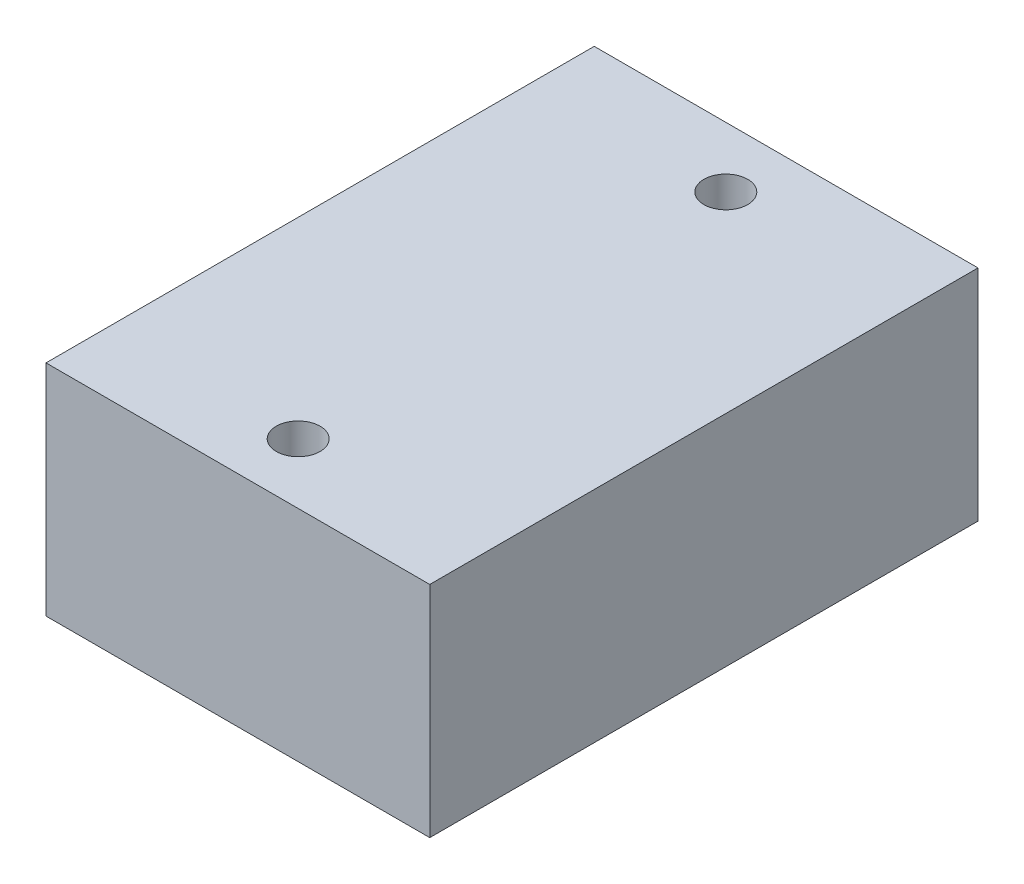
ISO-10303-21;
HEADER;
FILE_DESCRIPTION(('STEP AP214'),'2;1');
FILE_NAME('part.step','',(''),(''),'','','');
FILE_SCHEMA(('AUTOMOTIVE_DESIGN { 1 0 10303 214 1 1 1 1 }'));
ENDSEC;
DATA;
#1=APPLICATION_CONTEXT('core data for automotive mechanical design processes');
#2=APPLICATION_PROTOCOL_DEFINITION('international standard','automotive_design',2000,#1);
#3=PRODUCT_CONTEXT('',#1,'mechanical');
#4=PRODUCT('Part','Part','',(#3));
#5=PRODUCT_RELATED_PRODUCT_CATEGORY('part','',(#4));
#6=PRODUCT_DEFINITION_FORMATION('','',#4);
#7=PRODUCT_DEFINITION_CONTEXT('part definition',#1,'design');
#8=PRODUCT_DEFINITION('design','',#6,#7);
#9=PRODUCT_DEFINITION_SHAPE('','',#8);
#10=(LENGTH_UNIT() NAMED_UNIT(*) SI_UNIT(.MILLI.,.METRE.));
#11=(NAMED_UNIT(*) PLANE_ANGLE_UNIT() SI_UNIT($,.RADIAN.));
#12=(NAMED_UNIT(*) SI_UNIT($,.STERADIAN.) SOLID_ANGLE_UNIT());
#13=UNCERTAINTY_MEASURE_WITH_UNIT(LENGTH_MEASURE(1.E-05),#10,'distance_accuracy_value','');
#14=(GEOMETRIC_REPRESENTATION_CONTEXT(3) GLOBAL_UNCERTAINTY_ASSIGNED_CONTEXT((#13)) GLOBAL_UNIT_ASSIGNED_CONTEXT((#10,
#11,#12)) REPRESENTATION_CONTEXT('',''));
#15=CARTESIAN_POINT('',(0.,0.,0.));
#16=DIRECTION('',(0.,0.,1.));
#17=DIRECTION('',(1.,0.,0.));
#18=AXIS2_PLACEMENT_3D('',#15,#16,#17);
#19=CARTESIAN_POINT('',(0.,20.,0.));
#20=DIRECTION('',(0.,1.,0.));
#21=DIRECTION('',(0.,0.,1.));
#22=AXIS2_PLACEMENT_3D('',#19,#20,#21);
#23=PLANE('',#22);
#24=CARTESIAN_POINT('',(0.,20.,-19.5));
#25=DIRECTION('',(0.,1.,0.));
#26=DIRECTION('',(0.,0.,1.));
#27=AXIS2_PLACEMENT_3D('',#24,#25,#26);
#28=CIRCLE('',#27,2.);
#29=CARTESIAN_POINT('',(0.,20.,-17.5));
#30=VERTEX_POINT('',#29);
#31=EDGE_CURVE('E102',#30,#30,#28,.T.);
#32=ORIENTED_EDGE('',*,*,#31,.F.);
#33=EDGE_LOOP('',(#32));
#34=FACE_BOUND('',#33,.T.);
#35=DIRECTION('',(0.,0.,-1.));
#36=VECTOR('',#35,1.);
#37=CARTESIAN_POINT('',(17.5,20.,-25.));
#38=LINE('',#37,#36);
#39=CARTESIAN_POINT('',(17.5,20.,25.));
#40=VERTEX_POINT('',#39);
#41=CARTESIAN_POINT('',(17.5,20.,-25.));
#42=VERTEX_POINT('',#41);
#43=EDGE_CURVE('E87',#40,#42,#38,.T.);
#44=ORIENTED_EDGE('',*,*,#43,.T.);
#45=DIRECTION('',(-1.,0.,0.));
#46=VECTOR('',#45,1.);
#47=CARTESIAN_POINT('',(-17.5,20.,-25.));
#48=LINE('',#47,#46);
#49=CARTESIAN_POINT('',(-17.5,20.,-25.));
#50=VERTEX_POINT('',#49);
#51=EDGE_CURVE('E82',#42,#50,#48,.T.);
#52=ORIENTED_EDGE('',*,*,#51,.T.);
#53=DIRECTION('',(0.,0.,1.));
#54=VECTOR('',#53,1.);
#55=CARTESIAN_POINT('',(-17.5,20.,-25.));
#56=LINE('',#55,#54);
#57=CARTESIAN_POINT('',(-17.5,20.,25.));
#58=VERTEX_POINT('',#57);
#59=EDGE_CURVE('E85',#50,#58,#56,.T.);
#60=ORIENTED_EDGE('',*,*,#59,.T.);
#61=DIRECTION('',(1.,0.,0.));
#62=VECTOR('',#61,1.);
#63=CARTESIAN_POINT('',(-17.5,20.,25.));
#64=LINE('',#63,#62);
#65=EDGE_CURVE('E52',#58,#40,#64,.T.);
#66=ORIENTED_EDGE('',*,*,#65,.T.);
#67=EDGE_LOOP('',(#44,#52,#60,#66));
#68=FACE_BOUND('',#67,.T.);
#69=CARTESIAN_POINT('',(0.,20.,19.5));
#70=DIRECTION('',(0.,1.,0.));
#71=DIRECTION('',(0.,0.,1.));
#72=AXIS2_PLACEMENT_3D('',#69,#70,#71);
#73=CIRCLE('',#72,2.);
#74=CARTESIAN_POINT('',(0.,20.,21.5));
#75=VERTEX_POINT('',#74);
#76=EDGE_CURVE('E117',#75,#75,#73,.T.);
#77=ORIENTED_EDGE('',*,*,#76,.F.);
#78=EDGE_LOOP('',(#77));
#79=FACE_BOUND('',#78,.T.);
#80=ADVANCED_FACE('F35',(#34,#68,#79),#23,.T.);
#81=CARTESIAN_POINT('',(0.,0.,0.));
#82=DIRECTION('',(0.,1.,0.));
#83=DIRECTION('',(0.,0.,1.));
#84=AXIS2_PLACEMENT_3D('',#81,#82,#83);
#85=PLANE('',#84);
#86=DIRECTION('',(0.,0.,-1.));
#87=VECTOR('',#86,1.);
#88=CARTESIAN_POINT('',(17.5,0.,-25.));
#89=LINE('',#88,#87);
#90=CARTESIAN_POINT('',(17.5,0.,25.));
#91=VERTEX_POINT('',#90);
#92=CARTESIAN_POINT('',(17.5,0.,-25.));
#93=VERTEX_POINT('',#92);
#94=EDGE_CURVE('E99',#91,#93,#89,.T.);
#95=ORIENTED_EDGE('',*,*,#94,.F.);
#96=DIRECTION('',(1.,0.,0.));
#97=VECTOR('',#96,1.);
#98=CARTESIAN_POINT('',(-17.5,0.,25.));
#99=LINE('',#98,#97);
#100=CARTESIAN_POINT('',(-17.5,0.,25.));
#101=VERTEX_POINT('',#100);
#102=EDGE_CURVE('E75',#101,#91,#99,.T.);
#103=ORIENTED_EDGE('',*,*,#102,.F.);
#104=DIRECTION('',(0.,0.,1.));
#105=VECTOR('',#104,1.);
#106=CARTESIAN_POINT('',(-17.5,0.,-25.));
#107=LINE('',#106,#105);
#108=CARTESIAN_POINT('',(-17.5,0.,-25.));
#109=VERTEX_POINT('',#108);
#110=EDGE_CURVE('E69',#109,#101,#107,.T.);
#111=ORIENTED_EDGE('',*,*,#110,.F.);
#112=DIRECTION('',(-1.,0.,0.));
#113=VECTOR('',#112,1.);
#114=CARTESIAN_POINT('',(-17.5,0.,-25.));
#115=LINE('',#114,#113);
#116=EDGE_CURVE('E91',#93,#109,#115,.T.);
#117=ORIENTED_EDGE('',*,*,#116,.F.);
#118=EDGE_LOOP('',(#95,#103,#111,#117));
#119=FACE_BOUND('',#118,.T.);
#120=CARTESIAN_POINT('',(0.,0.,-19.5));
#121=DIRECTION('',(0.,1.,0.));
#122=DIRECTION('',(0.,0.,1.));
#123=AXIS2_PLACEMENT_3D('',#120,#121,#122);
#124=CIRCLE('',#123,2.);
#125=CARTESIAN_POINT('',(0.,0.,-17.5));
#126=VERTEX_POINT('',#125);
#127=EDGE_CURVE('E114',#126,#126,#124,.T.);
#128=ORIENTED_EDGE('',*,*,#127,.T.);
#129=EDGE_LOOP('',(#128));
#130=FACE_BOUND('',#129,.T.);
#131=CARTESIAN_POINT('',(0.,0.,19.5));
#132=DIRECTION('',(0.,1.,0.));
#133=DIRECTION('',(0.,0.,1.));
#134=AXIS2_PLACEMENT_3D('',#131,#132,#133);
#135=CIRCLE('',#134,2.);
#136=CARTESIAN_POINT('',(0.,0.,21.5));
#137=VERTEX_POINT('',#136);
#138=EDGE_CURVE('E120',#137,#137,#135,.T.);
#139=ORIENTED_EDGE('',*,*,#138,.T.);
#140=EDGE_LOOP('',(#139));
#141=FACE_BOUND('',#140,.T.);
#142=ADVANCED_FACE('F110',(#119,#130,#141),#85,.F.);
#143=CARTESIAN_POINT('',(17.5,20.,-25.));
#144=DIRECTION('',(-1.,0.,0.));
#145=DIRECTION('',(0.,0.,1.));
#146=AXIS2_PLACEMENT_3D('',#143,#144,#145);
#147=PLANE('',#146);
#148=ORIENTED_EDGE('',*,*,#94,.T.);
#149=DIRECTION('',(0.,-1.,0.));
#150=VECTOR('',#149,1.);
#151=CARTESIAN_POINT('',(17.5,20.,-25.));
#152=LINE('',#151,#150);
#153=EDGE_CURVE('E11',#42,#93,#152,.T.);
#154=ORIENTED_EDGE('',*,*,#153,.F.);
#155=ORIENTED_EDGE('',*,*,#43,.F.);
#156=DIRECTION('',(0.,-1.,0.));
#157=VECTOR('',#156,1.);
#158=CARTESIAN_POINT('',(17.5,20.,25.));
#159=LINE('',#158,#157);
#160=EDGE_CURVE('E95',#40,#91,#159,.T.);
#161=ORIENTED_EDGE('',*,*,#160,.T.);
#162=EDGE_LOOP('',(#148,#154,#155,#161));
#163=FACE_BOUND('',#162,.T.);
#164=ADVANCED_FACE('F37',(#163),#147,.F.);
#165=CARTESIAN_POINT('',(-17.5,20.,-25.));
#166=DIRECTION('',(0.,0.,1.));
#167=DIRECTION('',(1.,0.,0.));
#168=AXIS2_PLACEMENT_3D('',#165,#166,#167);
#169=PLANE('',#168);
#170=ORIENTED_EDGE('',*,*,#116,.T.);
#171=DIRECTION('',(0.,-1.,0.));
#172=VECTOR('',#171,1.);
#173=CARTESIAN_POINT('',(-17.5,20.,-25.));
#174=LINE('',#173,#172);
#175=EDGE_CURVE('E44',#50,#109,#174,.T.);
#176=ORIENTED_EDGE('',*,*,#175,.F.);
#177=ORIENTED_EDGE('',*,*,#51,.F.);
#178=ORIENTED_EDGE('',*,*,#153,.T.);
#179=EDGE_LOOP('',(#170,#176,#177,#178));
#180=FACE_BOUND('',#179,.T.);
#181=ADVANCED_FACE('F90',(#180),#169,.F.);
#182=CARTESIAN_POINT('',(-17.5,20.,-25.));
#183=DIRECTION('',(1.,0.,0.));
#184=DIRECTION('',(0.,0.,-1.));
#185=AXIS2_PLACEMENT_3D('',#182,#183,#184);
#186=PLANE('',#185);
#187=ORIENTED_EDGE('',*,*,#110,.T.);
#188=DIRECTION('',(0.,-1.,0.));
#189=VECTOR('',#188,1.);
#190=CARTESIAN_POINT('',(-17.5,20.,25.));
#191=LINE('',#190,#189);
#192=EDGE_CURVE('E92',#58,#101,#191,.T.);
#193=ORIENTED_EDGE('',*,*,#192,.F.);
#194=ORIENTED_EDGE('',*,*,#59,.F.);
#195=ORIENTED_EDGE('',*,*,#175,.T.);
#196=EDGE_LOOP('',(#187,#193,#194,#195));
#197=FACE_BOUND('',#196,.T.);
#198=ADVANCED_FACE('F93',(#197),#186,.F.);
#199=CARTESIAN_POINT('',(-17.5,20.,25.));
#200=DIRECTION('',(0.,0.,-1.));
#201=DIRECTION('',(-1.,0.,0.));
#202=AXIS2_PLACEMENT_3D('',#199,#200,#201);
#203=PLANE('',#202);
#204=ORIENTED_EDGE('',*,*,#102,.T.);
#205=ORIENTED_EDGE('',*,*,#160,.F.);
#206=ORIENTED_EDGE('',*,*,#65,.F.);
#207=ORIENTED_EDGE('',*,*,#192,.T.);
#208=EDGE_LOOP('',(#204,#205,#206,#207));
#209=FACE_BOUND('',#208,.T.);
#210=ADVANCED_FACE('F107',(#209),#203,.F.);
#211=CARTESIAN_POINT('',(0.,20.,-19.5));
#212=DIRECTION('',(0.,-1.,0.));
#213=DIRECTION('',(0.,0.,-1.));
#214=AXIS2_PLACEMENT_3D('',#211,#212,#213);
#215=CYLINDRICAL_SURFACE('',#214,2.);
#216=ORIENTED_EDGE('',*,*,#31,.T.);
#217=EDGE_LOOP('',(#216));
#218=FACE_BOUND('',#217,.T.);
#219=ORIENTED_EDGE('',*,*,#127,.F.);
#220=EDGE_LOOP('',(#219));
#221=FACE_BOUND('',#220,.T.);
#222=ADVANCED_FACE('F137',(#218,#221),#215,.F.);
#223=CARTESIAN_POINT('',(0.,20.,19.5));
#224=DIRECTION('',(0.,-1.,0.));
#225=DIRECTION('',(0.,0.,-1.));
#226=AXIS2_PLACEMENT_3D('',#223,#224,#225);
#227=CYLINDRICAL_SURFACE('',#226,2.);
#228=ORIENTED_EDGE('',*,*,#76,.T.);
#229=EDGE_LOOP('',(#228));
#230=FACE_BOUND('',#229,.T.);
#231=ORIENTED_EDGE('',*,*,#138,.F.);
#232=EDGE_LOOP('',(#231));
#233=FACE_BOUND('',#232,.T.);
#234=ADVANCED_FACE('F126',(#230,#233),#227,.F.);
#235=CLOSED_SHELL('',(#80,#142,#164,#181,#198,#210,#222,#234));
#236=MANIFOLD_SOLID_BREP('B2',#235);
#237=ADVANCED_BREP_SHAPE_REPRESENTATION('',(#18,#236),#14);
#238=SHAPE_DEFINITION_REPRESENTATION(#9,#237);
ENDSEC;
END-ISO-10303-21;
